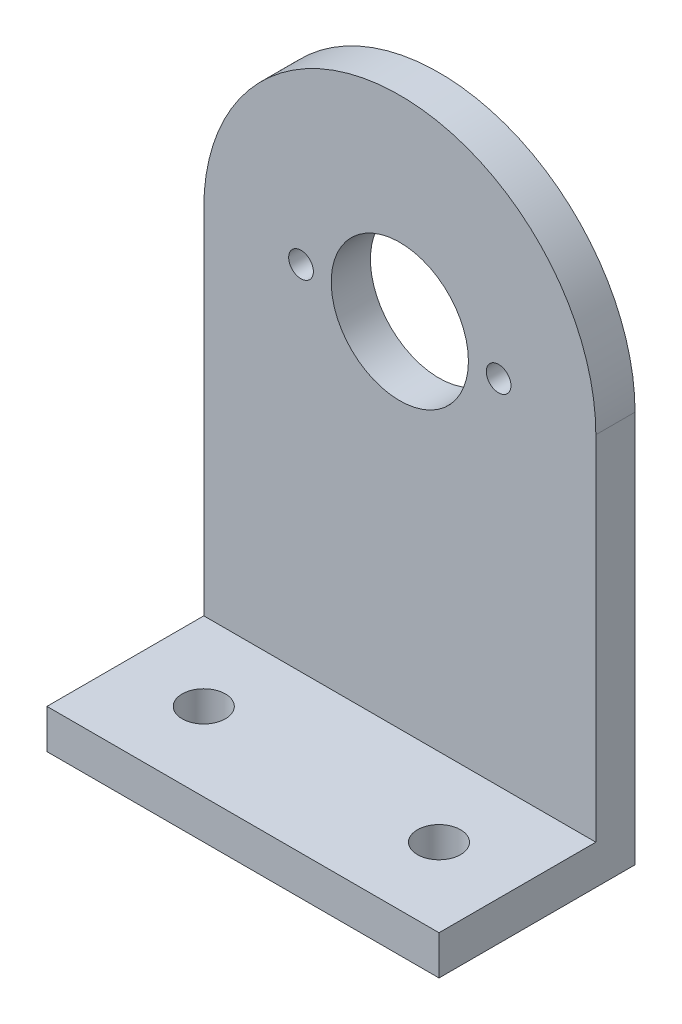
ISO-10303-21;
HEADER;
FILE_DESCRIPTION(('STEP AP214'),'2;1');
FILE_NAME('part.step','',(''),(''),'','','');
FILE_SCHEMA(('AUTOMOTIVE_DESIGN { 1 0 10303 214 1 1 1 1 }'));
ENDSEC;
DATA;
#1=APPLICATION_CONTEXT('core data for automotive mechanical design processes');
#2=APPLICATION_PROTOCOL_DEFINITION('international standard','automotive_design',2000,#1);
#3=PRODUCT_CONTEXT('',#1,'mechanical');
#4=PRODUCT('Part','Part','',(#3));
#5=PRODUCT_RELATED_PRODUCT_CATEGORY('part','',(#4));
#6=PRODUCT_DEFINITION_FORMATION('','',#4);
#7=PRODUCT_DEFINITION_CONTEXT('part definition',#1,'design');
#8=PRODUCT_DEFINITION('design','',#6,#7);
#9=PRODUCT_DEFINITION_SHAPE('','',#8);
#10=(LENGTH_UNIT() NAMED_UNIT(*) SI_UNIT(.MILLI.,.METRE.));
#11=(NAMED_UNIT(*) PLANE_ANGLE_UNIT() SI_UNIT($,.RADIAN.));
#12=(NAMED_UNIT(*) SI_UNIT($,.STERADIAN.) SOLID_ANGLE_UNIT());
#13=UNCERTAINTY_MEASURE_WITH_UNIT(LENGTH_MEASURE(1.E-05),#10,'distance_accuracy_value','');
#14=(GEOMETRIC_REPRESENTATION_CONTEXT(3) GLOBAL_UNCERTAINTY_ASSIGNED_CONTEXT((#13)) GLOBAL_UNIT_ASSIGNED_CONTEXT((#10,
#11,#12)) REPRESENTATION_CONTEXT('',''));
#15=CARTESIAN_POINT('',(0.,0.,0.));
#16=DIRECTION('',(0.,0.,1.));
#17=DIRECTION('',(1.,0.,0.));
#18=AXIS2_PLACEMENT_3D('',#15,#16,#17);
#19=CARTESIAN_POINT('',(0.,0.,3.175));
#20=DIRECTION('',(0.,0.,-1.));
#21=DIRECTION('',(-1.,0.,0.));
#22=AXIS2_PLACEMENT_3D('',#19,#20,#21);
#23=CYLINDRICAL_SURFACE('',#22,15.875);
#24=CARTESIAN_POINT('',(0.,0.,3.175));
#25=DIRECTION('',(0.,0.,1.));
#26=DIRECTION('',(1.,0.,0.));
#27=AXIS2_PLACEMENT_3D('',#24,#25,#26);
#28=CIRCLE('',#27,15.875);
#29=CARTESIAN_POINT('',(15.875,0.,3.175));
#30=VERTEX_POINT('',#29);
#31=CARTESIAN_POINT('',(-15.875,0.,3.175));
#32=VERTEX_POINT('',#31);
#33=EDGE_CURVE('E161',#30,#32,#28,.T.);
#34=ORIENTED_EDGE('',*,*,#33,.F.);
#35=DIRECTION('',(0.,0.,-1.));
#36=VECTOR('',#35,1.);
#37=CARTESIAN_POINT('',(15.875,0.,3.175));
#38=LINE('',#37,#36);
#39=CARTESIAN_POINT('',(15.875,0.,0.));
#40=VERTEX_POINT('',#39);
#41=EDGE_CURVE('E102',#30,#40,#38,.T.);
#42=ORIENTED_EDGE('',*,*,#41,.T.);
#43=CARTESIAN_POINT('',(0.,0.,0.));
#44=DIRECTION('',(0.,0.,1.));
#45=DIRECTION('',(1.,0.,0.));
#46=AXIS2_PLACEMENT_3D('',#43,#44,#45);
#47=CIRCLE('',#46,15.875);
#48=CARTESIAN_POINT('',(-15.875,0.,0.));
#49=VERTEX_POINT('',#48);
#50=EDGE_CURVE('E164',#40,#49,#47,.T.);
#51=ORIENTED_EDGE('',*,*,#50,.T.);
#52=DIRECTION('',(0.,0.,-1.));
#53=VECTOR('',#52,1.);
#54=CARTESIAN_POINT('',(-15.875,0.,3.175));
#55=LINE('',#54,#53);
#56=EDGE_CURVE('E82',#32,#49,#55,.T.);
#57=ORIENTED_EDGE('',*,*,#56,.F.);
#58=EDGE_LOOP('',(#34,#42,#51,#57));
#59=FACE_BOUND('',#58,.T.);
#60=ADVANCED_FACE('F57',(#59),#23,.T.);
#61=CARTESIAN_POINT('',(0.,0.,0.));
#62=DIRECTION('',(0.,0.,1.));
#63=DIRECTION('',(1.,0.,0.));
#64=AXIS2_PLACEMENT_3D('',#61,#62,#63);
#65=PLANE('',#64);
#66=CARTESIAN_POINT('',(-8.001,0.,0.));
#67=DIRECTION('',(0.,0.,1.));
#68=DIRECTION('',(1.,0.,0.));
#69=AXIS2_PLACEMENT_3D('',#66,#67,#68);
#70=CIRCLE('',#69,1.76199999999999);
#71=CARTESIAN_POINT('',(-6.23900000000001,0.,0.));
#72=VERTEX_POINT('',#71);
#73=EDGE_CURVE('E180',#72,#72,#70,.T.);
#74=ORIENTED_EDGE('',*,*,#73,.T.);
#75=EDGE_LOOP('',(#74));
#76=FACE_BOUND('',#75,.T.);
#77=CARTESIAN_POINT('',(8.001,0.,0.));
#78=DIRECTION('',(0.,0.,1.));
#79=DIRECTION('',(1.,0.,0.));
#80=AXIS2_PLACEMENT_3D('',#77,#78,#79);
#81=CIRCLE('',#80,1.76200000000001);
#82=CARTESIAN_POINT('',(9.76300000000001,0.,0.));
#83=VERTEX_POINT('',#82);
#84=EDGE_CURVE('E168',#83,#83,#81,.T.);
#85=ORIENTED_EDGE('',*,*,#84,.T.);
#86=EDGE_LOOP('',(#85));
#87=FACE_BOUND('',#86,.T.);
#88=CARTESIAN_POINT('',(0.,0.,0.));
#89=DIRECTION('',(0.,0.,1.));
#90=DIRECTION('',(1.,0.,0.));
#91=AXIS2_PLACEMENT_3D('',#88,#89,#90);
#92=CIRCLE('',#91,5.55625);
#93=CARTESIAN_POINT('',(5.55625,0.,0.));
#94=VERTEX_POINT('',#93);
#95=EDGE_CURVE('E155',#94,#94,#92,.T.);
#96=ORIENTED_EDGE('',*,*,#95,.T.);
#97=EDGE_LOOP('',(#96));
#98=FACE_BOUND('',#97,.T.);
#99=ORIENTED_EDGE('',*,*,#50,.F.);
#100=DIRECTION('',(0.,-1.,0.));
#101=VECTOR('',#100,1.);
#102=CARTESIAN_POINT('',(15.875,0.,0.));
#103=LINE('',#102,#101);
#104=CARTESIAN_POINT('',(15.875,-31.75,0.));
#105=VERTEX_POINT('',#104);
#106=EDGE_CURVE('E173',#40,#105,#103,.T.);
#107=ORIENTED_EDGE('',*,*,#106,.T.);
#108=DIRECTION('',(1.,0.,0.));
#109=VECTOR('',#108,1.);
#110=CARTESIAN_POINT('',(-15.875,-31.75,0.));
#111=LINE('',#110,#109);
#112=CARTESIAN_POINT('',(-15.875,-31.75,0.));
#113=VERTEX_POINT('',#112);
#114=EDGE_CURVE('E158',#113,#105,#111,.T.);
#115=ORIENTED_EDGE('',*,*,#114,.F.);
#116=DIRECTION('',(0.,-1.,0.));
#117=VECTOR('',#116,1.);
#118=CARTESIAN_POINT('',(-15.875,0.,0.));
#119=LINE('',#118,#117);
#120=EDGE_CURVE('E98',#49,#113,#119,.T.);
#121=ORIENTED_EDGE('',*,*,#120,.F.);
#122=EDGE_LOOP('',(#99,#107,#115,#121));
#123=FACE_BOUND('',#122,.T.);
#124=ADVANCED_FACE('F193',(#76,#87,#98,#123),#65,.F.);
#125=CARTESIAN_POINT('',(0.,0.,3.175));
#126=DIRECTION('',(0.,0.,1.));
#127=DIRECTION('',(1.,0.,0.));
#128=AXIS2_PLACEMENT_3D('',#125,#126,#127);
#129=PLANE('',#128);
#130=CARTESIAN_POINT('',(-8.001,0.,3.175));
#131=DIRECTION('',(0.,0.,1.));
#132=DIRECTION('',(1.,0.,0.));
#133=AXIS2_PLACEMENT_3D('',#130,#131,#132);
#134=CIRCLE('',#133,0.999999999999998);
#135=CARTESIAN_POINT('',(-7.001,0.,3.175));
#136=VERTEX_POINT('',#135);
#137=EDGE_CURVE('E357',#136,#136,#134,.T.);
#138=ORIENTED_EDGE('',*,*,#137,.F.);
#139=EDGE_LOOP('',(#138));
#140=FACE_BOUND('',#139,.T.);
#141=CARTESIAN_POINT('',(8.001,0.,3.175));
#142=DIRECTION('',(0.,0.,1.));
#143=DIRECTION('',(1.,0.,0.));
#144=AXIS2_PLACEMENT_3D('',#141,#142,#143);
#145=CIRCLE('',#144,0.999999999999999);
#146=CARTESIAN_POINT('',(9.001,0.,3.175));
#147=VERTEX_POINT('',#146);
#148=EDGE_CURVE('E356',#147,#147,#145,.T.);
#149=ORIENTED_EDGE('',*,*,#148,.F.);
#150=EDGE_LOOP('',(#149));
#151=FACE_BOUND('',#150,.T.);
#152=DIRECTION('',(-1.,0.,0.));
#153=VECTOR('',#152,1.);
#154=CARTESIAN_POINT('',(-15.875,-28.575,3.175));
#155=LINE('',#154,#153);
#156=CARTESIAN_POINT('',(15.875,-28.575,3.175));
#157=VERTEX_POINT('',#156);
#158=CARTESIAN_POINT('',(-15.875,-28.575,3.175));
#159=VERTEX_POINT('',#158);
#160=EDGE_CURVE('E73',#157,#159,#155,.T.);
#161=ORIENTED_EDGE('',*,*,#160,.F.);
#162=DIRECTION('',(0.,-1.,0.));
#163=VECTOR('',#162,1.);
#164=CARTESIAN_POINT('',(15.875,0.,3.175));
#165=LINE('',#164,#163);
#166=EDGE_CURVE('E169',#30,#157,#165,.T.);
#167=ORIENTED_EDGE('',*,*,#166,.F.);
#168=ORIENTED_EDGE('',*,*,#33,.T.);
#169=DIRECTION('',(0.,-1.,0.));
#170=VECTOR('',#169,1.);
#171=CARTESIAN_POINT('',(-15.875,0.,3.175));
#172=LINE('',#171,#170);
#173=EDGE_CURVE('E127',#32,#159,#172,.T.);
#174=ORIENTED_EDGE('',*,*,#173,.T.);
#175=EDGE_LOOP('',(#161,#167,#168,#174));
#176=FACE_BOUND('',#175,.T.);
#177=CARTESIAN_POINT('',(0.,0.,3.175));
#178=DIRECTION('',(0.,0.,1.));
#179=DIRECTION('',(1.,0.,0.));
#180=AXIS2_PLACEMENT_3D('',#177,#178,#179);
#181=CIRCLE('',#180,5.55625);
#182=CARTESIAN_POINT('',(5.55625,0.,3.175));
#183=VERTEX_POINT('',#182);
#184=EDGE_CURVE('E154',#183,#183,#181,.T.);
#185=ORIENTED_EDGE('',*,*,#184,.F.);
#186=EDGE_LOOP('',(#185));
#187=FACE_BOUND('',#186,.T.);
#188=ADVANCED_FACE('F196',(#140,#151,#176,#187),#129,.T.);
#189=CARTESIAN_POINT('',(-15.875,0.,3.175));
#190=DIRECTION('',(1.,0.,0.));
#191=DIRECTION('',(0.,1.,0.));
#192=AXIS2_PLACEMENT_3D('',#189,#190,#191);
#193=PLANE('',#192);
#194=ORIENTED_EDGE('',*,*,#120,.T.);
#195=DIRECTION('',(0.,0.,-1.));
#196=VECTOR('',#195,1.);
#197=CARTESIAN_POINT('',(-15.875,-31.75,3.175));
#198=LINE('',#197,#196);
#199=CARTESIAN_POINT('',(-15.875,-31.75,15.875));
#200=VERTEX_POINT('',#199);
#201=EDGE_CURVE('E117',#200,#113,#198,.T.);
#202=ORIENTED_EDGE('',*,*,#201,.F.);
#203=DIRECTION('',(0.,-1.,0.));
#204=VECTOR('',#203,1.);
#205=CARTESIAN_POINT('',(-15.875,-31.75,15.875));
#206=LINE('',#205,#204);
#207=CARTESIAN_POINT('',(-15.875,-28.575,15.875));
#208=VERTEX_POINT('',#207);
#209=EDGE_CURVE('E122',#208,#200,#206,.T.);
#210=ORIENTED_EDGE('',*,*,#209,.F.);
#211=DIRECTION('',(0.,0.,-1.));
#212=VECTOR('',#211,1.);
#213=CARTESIAN_POINT('',(-15.875,-28.575,15.875));
#214=LINE('',#213,#212);
#215=EDGE_CURVE('E148',#208,#159,#214,.T.);
#216=ORIENTED_EDGE('',*,*,#215,.T.);
#217=ORIENTED_EDGE('',*,*,#173,.F.);
#218=ORIENTED_EDGE('',*,*,#56,.T.);
#219=EDGE_LOOP('',(#194,#202,#210,#216,#217,#218));
#220=FACE_BOUND('',#219,.T.);
#221=ADVANCED_FACE('F119',(#220),#193,.F.);
#222=CARTESIAN_POINT('',(-15.875,-31.75,3.175));
#223=DIRECTION('',(0.,1.,0.));
#224=DIRECTION('',(0.,0.,1.));
#225=AXIS2_PLACEMENT_3D('',#222,#223,#224);
#226=PLANE('',#225);
#227=CARTESIAN_POINT('',(-9.525,-31.75,9.525));
#228=DIRECTION('',(0.,1.,0.));
#229=DIRECTION('',(0.,0.,1.));
#230=AXIS2_PLACEMENT_3D('',#227,#228,#229);
#231=CIRCLE('',#230,1.75);
#232=CARTESIAN_POINT('',(-9.525,-31.75,11.275));
#233=VERTEX_POINT('',#232);
#234=EDGE_CURVE('E141',#233,#233,#231,.T.);
#235=ORIENTED_EDGE('',*,*,#234,.T.);
#236=EDGE_LOOP('',(#235));
#237=FACE_BOUND('',#236,.T.);
#238=CARTESIAN_POINT('',(9.52500000000001,-31.75,9.52500000000001));
#239=DIRECTION('',(0.,1.,0.));
#240=DIRECTION('',(0.,0.,-1.));
#241=AXIS2_PLACEMENT_3D('',#238,#239,#240);
#242=CIRCLE('',#241,1.75);
#243=CARTESIAN_POINT('',(9.52500000000001,-31.75,7.775));
#244=VERTEX_POINT('',#243);
#245=EDGE_CURVE('E144',#244,#244,#242,.T.);
#246=ORIENTED_EDGE('',*,*,#245,.T.);
#247=EDGE_LOOP('',(#246));
#248=FACE_BOUND('',#247,.T.);
#249=ORIENTED_EDGE('',*,*,#114,.T.);
#250=DIRECTION('',(0.,0.,-1.));
#251=VECTOR('',#250,1.);
#252=CARTESIAN_POINT('',(15.875,-31.75,3.175));
#253=LINE('',#252,#251);
#254=CARTESIAN_POINT('',(15.875,-31.75,15.875));
#255=VERTEX_POINT('',#254);
#256=EDGE_CURVE('E126',#255,#105,#253,.T.);
#257=ORIENTED_EDGE('',*,*,#256,.F.);
#258=DIRECTION('',(1.,0.,0.));
#259=VECTOR('',#258,1.);
#260=CARTESIAN_POINT('',(-15.875,-31.75,15.875));
#261=LINE('',#260,#259);
#262=EDGE_CURVE('E130',#200,#255,#261,.T.);
#263=ORIENTED_EDGE('',*,*,#262,.F.);
#264=ORIENTED_EDGE('',*,*,#201,.T.);
#265=EDGE_LOOP('',(#249,#257,#263,#264));
#266=FACE_BOUND('',#265,.T.);
#267=ADVANCED_FACE('F131',(#237,#248,#266),#226,.F.);
#268=CARTESIAN_POINT('',(15.875,0.,3.175));
#269=DIRECTION('',(1.,0.,0.));
#270=DIRECTION('',(0.,1.,0.));
#271=AXIS2_PLACEMENT_3D('',#268,#269,#270);
#272=PLANE('',#271);
#273=ORIENTED_EDGE('',*,*,#106,.F.);
#274=ORIENTED_EDGE('',*,*,#41,.F.);
#275=ORIENTED_EDGE('',*,*,#166,.T.);
#276=DIRECTION('',(0.,0.,-1.));
#277=VECTOR('',#276,1.);
#278=CARTESIAN_POINT('',(15.875,-28.575,15.875));
#279=LINE('',#278,#277);
#280=CARTESIAN_POINT('',(15.875,-28.575,15.875));
#281=VERTEX_POINT('',#280);
#282=EDGE_CURVE('E151',#281,#157,#279,.T.);
#283=ORIENTED_EDGE('',*,*,#282,.F.);
#284=DIRECTION('',(0.,1.,0.));
#285=VECTOR('',#284,1.);
#286=CARTESIAN_POINT('',(15.875,-31.75,15.875));
#287=LINE('',#286,#285);
#288=EDGE_CURVE('E134',#255,#281,#287,.T.);
#289=ORIENTED_EDGE('',*,*,#288,.F.);
#290=ORIENTED_EDGE('',*,*,#256,.T.);
#291=EDGE_LOOP('',(#273,#274,#275,#283,#289,#290));
#292=FACE_BOUND('',#291,.T.);
#293=ADVANCED_FACE('F213',(#292),#272,.T.);
#294=CARTESIAN_POINT('',(0.,0.,0.));
#295=DIRECTION('',(0.,0.,1.));
#296=DIRECTION('',(1.,0.,0.));
#297=AXIS2_PLACEMENT_3D('',#294,#295,#296);
#298=CYLINDRICAL_SURFACE('',#297,5.55625);
#299=ORIENTED_EDGE('',*,*,#95,.F.);
#300=EDGE_LOOP('',(#299));
#301=FACE_BOUND('',#300,.T.);
#302=ORIENTED_EDGE('',*,*,#184,.T.);
#303=EDGE_LOOP('',(#302));
#304=FACE_BOUND('',#303,.T.);
#305=ADVANCED_FACE('F212',(#301,#304),#298,.F.);
#306=CARTESIAN_POINT('',(-15.875,-28.575,15.875));
#307=DIRECTION('',(0.,-1.,0.));
#308=DIRECTION('',(0.,0.,-1.));
#309=AXIS2_PLACEMENT_3D('',#306,#307,#308);
#310=PLANE('',#309);
#311=CARTESIAN_POINT('',(-9.525,-28.575,9.525));
#312=DIRECTION('',(0.,1.,0.));
#313=DIRECTION('',(0.,0.,1.));
#314=AXIS2_PLACEMENT_3D('',#311,#312,#313);
#315=CIRCLE('',#314,1.75);
#316=CARTESIAN_POINT('',(-9.525,-28.575,11.275));
#317=VERTEX_POINT('',#316);
#318=EDGE_CURVE('E365',#317,#317,#315,.T.);
#319=ORIENTED_EDGE('',*,*,#318,.F.);
#320=EDGE_LOOP('',(#319));
#321=FACE_BOUND('',#320,.T.);
#322=CARTESIAN_POINT('',(9.52500000000001,-28.575,9.52500000000001));
#323=DIRECTION('',(0.,1.,0.));
#324=DIRECTION('',(0.,0.,-1.));
#325=AXIS2_PLACEMENT_3D('',#322,#323,#324);
#326=CIRCLE('',#325,1.75);
#327=CARTESIAN_POINT('',(9.52500000000001,-28.575,7.775));
#328=VERTEX_POINT('',#327);
#329=EDGE_CURVE('E360',#328,#328,#326,.T.);
#330=ORIENTED_EDGE('',*,*,#329,.F.);
#331=EDGE_LOOP('',(#330));
#332=FACE_BOUND('',#331,.T.);
#333=ORIENTED_EDGE('',*,*,#160,.T.);
#334=ORIENTED_EDGE('',*,*,#215,.F.);
#335=DIRECTION('',(-1.,0.,0.));
#336=VECTOR('',#335,1.);
#337=CARTESIAN_POINT('',(-15.875,-28.575,15.875));
#338=LINE('',#337,#336);
#339=EDGE_CURVE('E138',#281,#208,#338,.T.);
#340=ORIENTED_EDGE('',*,*,#339,.F.);
#341=ORIENTED_EDGE('',*,*,#282,.T.);
#342=EDGE_LOOP('',(#333,#334,#340,#341));
#343=FACE_BOUND('',#342,.T.);
#344=ADVANCED_FACE('F239',(#321,#332,#343),#310,.F.);
#345=CARTESIAN_POINT('',(0.,0.,15.875));
#346=DIRECTION('',(0.,0.,-1.));
#347=DIRECTION('',(-1.,0.,0.));
#348=AXIS2_PLACEMENT_3D('',#345,#346,#347);
#349=PLANE('',#348);
#350=ORIENTED_EDGE('',*,*,#209,.T.);
#351=ORIENTED_EDGE('',*,*,#262,.T.);
#352=ORIENTED_EDGE('',*,*,#288,.T.);
#353=ORIENTED_EDGE('',*,*,#339,.T.);
#354=EDGE_LOOP('',(#350,#351,#352,#353));
#355=FACE_BOUND('',#354,.T.);
#356=ADVANCED_FACE('F136',(#355),#349,.F.);
#357=CARTESIAN_POINT('',(9.52500000000001,-31.75,9.52500000000001));
#358=DIRECTION('',(0.,1.,0.));
#359=DIRECTION('',(0.,0.,1.));
#360=AXIS2_PLACEMENT_3D('',#357,#358,#359);
#361=CYLINDRICAL_SURFACE('',#360,1.75);
#362=ORIENTED_EDGE('',*,*,#245,.F.);
#363=EDGE_LOOP('',(#362));
#364=FACE_BOUND('',#363,.T.);
#365=ORIENTED_EDGE('',*,*,#329,.T.);
#366=EDGE_LOOP('',(#365));
#367=FACE_BOUND('',#366,.T.);
#368=ADVANCED_FACE('F244',(#364,#367),#361,.F.);
#369=CARTESIAN_POINT('',(-9.525,-31.75,9.525));
#370=DIRECTION('',(0.,1.,0.));
#371=DIRECTION('',(0.,0.,1.));
#372=AXIS2_PLACEMENT_3D('',#369,#370,#371);
#373=CYLINDRICAL_SURFACE('',#372,1.75);
#374=ORIENTED_EDGE('',*,*,#234,.F.);
#375=EDGE_LOOP('',(#374));
#376=FACE_BOUND('',#375,.T.);
#377=ORIENTED_EDGE('',*,*,#318,.T.);
#378=EDGE_LOOP('',(#377));
#379=FACE_BOUND('',#378,.T.);
#380=ADVANCED_FACE('F247',(#376,#379),#373,.F.);
#381=CARTESIAN_POINT('',(8.001,0.,3.175));
#382=DIRECTION('',(0.,0.,1.));
#383=DIRECTION('',(1.,0.,0.));
#384=AXIS2_PLACEMENT_3D('',#381,#382,#383);
#385=CYLINDRICAL_SURFACE('',#384,0.999999999999998);
#386=CARTESIAN_POINT('',(8.001,0.,0.762000000000005));
#387=DIRECTION('',(0.,0.,1.));
#388=DIRECTION('',(1.,0.,0.));
#389=AXIS2_PLACEMENT_3D('',#386,#387,#388);
#390=CIRCLE('',#389,0.999999999999998);
#391=CARTESIAN_POINT('',(9.001,0.,0.762000000000005));
#392=VERTEX_POINT('',#391);
#393=EDGE_CURVE('E12',#392,#392,#390,.F.);
#394=ORIENTED_EDGE('',*,*,#393,.T.);
#395=EDGE_LOOP('',(#394));
#396=FACE_BOUND('',#395,.T.);
#397=ORIENTED_EDGE('',*,*,#148,.T.);
#398=EDGE_LOOP('',(#397));
#399=FACE_BOUND('',#398,.T.);
#400=ADVANCED_FACE('F250',(#396,#399),#385,.F.);
#401=CARTESIAN_POINT('',(-8.001,0.,3.175));
#402=DIRECTION('',(0.,0.,1.));
#403=DIRECTION('',(1.,0.,0.));
#404=AXIS2_PLACEMENT_3D('',#401,#402,#403);
#405=CYLINDRICAL_SURFACE('',#404,0.999999999999998);
#406=CARTESIAN_POINT('',(-8.001,0.,0.762000000000003));
#407=DIRECTION('',(0.,0.,1.));
#408=DIRECTION('',(1.,0.,0.));
#409=AXIS2_PLACEMENT_3D('',#406,#407,#408);
#410=CIRCLE('',#409,0.999999999999998);
#411=CARTESIAN_POINT('',(-7.001,0.,0.762000000000003));
#412=VERTEX_POINT('',#411);
#413=EDGE_CURVE('E66',#412,#412,#410,.F.);
#414=ORIENTED_EDGE('',*,*,#413,.T.);
#415=EDGE_LOOP('',(#414));
#416=FACE_BOUND('',#415,.T.);
#417=ORIENTED_EDGE('',*,*,#137,.T.);
#418=EDGE_LOOP('',(#417));
#419=FACE_BOUND('',#418,.T.);
#420=ADVANCED_FACE('F185',(#416,#419),#405,.F.);
#421=CARTESIAN_POINT('',(-8.001,0.,0.));
#422=DIRECTION('',(0.,0.,-1.));
#423=DIRECTION('',(-1.,0.,0.));
#424=AXIS2_PLACEMENT_3D('',#421,#422,#423);
#425=CONICAL_SURFACE('',#424,1.76199999999999,0.785398163397443);
#426=ORIENTED_EDGE('',*,*,#413,.F.);
#427=EDGE_LOOP('',(#426));
#428=FACE_BOUND('',#427,.T.);
#429=ORIENTED_EDGE('',*,*,#73,.F.);
#430=EDGE_LOOP('',(#429));
#431=FACE_BOUND('',#430,.T.);
#432=ADVANCED_FACE('F188',(#428,#431),#425,.F.);
#433=CARTESIAN_POINT('',(8.001,0.,0.));
#434=DIRECTION('',(0.,0.,-1.));
#435=DIRECTION('',(-1.,0.,0.));
#436=AXIS2_PLACEMENT_3D('',#433,#434,#435);
#437=CONICAL_SURFACE('',#436,1.76200000000001,0.785398163397451);
#438=ORIENTED_EDGE('',*,*,#393,.F.);
#439=EDGE_LOOP('',(#438));
#440=FACE_BOUND('',#439,.T.);
#441=ORIENTED_EDGE('',*,*,#84,.F.);
#442=EDGE_LOOP('',(#441));
#443=FACE_BOUND('',#442,.T.);
#444=ADVANCED_FACE('F60',(#440,#443),#437,.F.);
#445=CLOSED_SHELL('',(#60,#124,#188,#221,#267,#293,#305,#344,#356,#368,#380,#400,#420,#432,#444));
#446=MANIFOLD_SOLID_BREP('B2',#445);
#447=ADVANCED_BREP_SHAPE_REPRESENTATION('',(#18,#446),#14);
#448=SHAPE_DEFINITION_REPRESENTATION(#9,#447);
ENDSEC;
END-ISO-10303-21;
